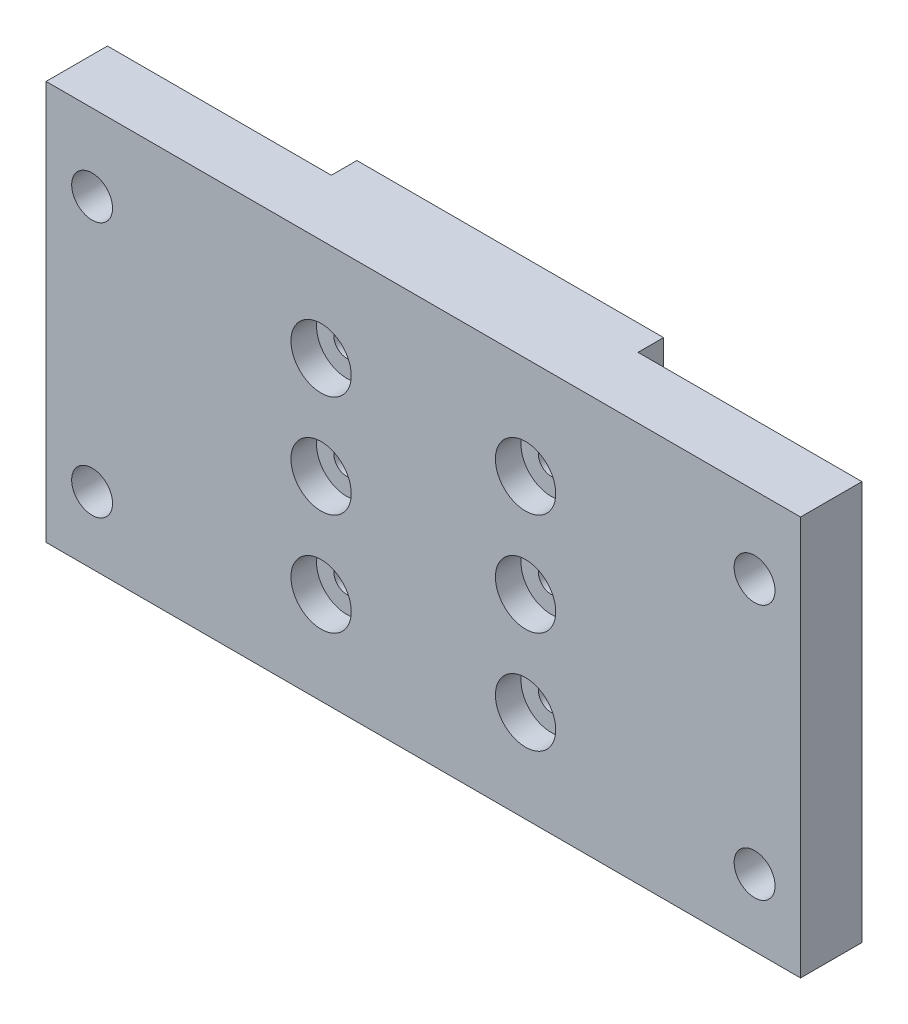
ISO-10303-21;
HEADER;
FILE_DESCRIPTION(('STEP AP214'),'2;1');
FILE_NAME('part.step','',(''),(''),'','','');
FILE_SCHEMA(('AUTOMOTIVE_DESIGN { 1 0 10303 214 1 1 1 1 }'));
ENDSEC;
DATA;
#1=APPLICATION_CONTEXT('core data for automotive mechanical design processes');
#2=APPLICATION_PROTOCOL_DEFINITION('international standard','automotive_design',2000,#1);
#3=PRODUCT_CONTEXT('',#1,'mechanical');
#4=PRODUCT('Part','Part','',(#3));
#5=PRODUCT_RELATED_PRODUCT_CATEGORY('part','',(#4));
#6=PRODUCT_DEFINITION_FORMATION('','',#4);
#7=PRODUCT_DEFINITION_CONTEXT('part definition',#1,'design');
#8=PRODUCT_DEFINITION('design','',#6,#7);
#9=PRODUCT_DEFINITION_SHAPE('','',#8);
#10=(LENGTH_UNIT() NAMED_UNIT(*) SI_UNIT(.MILLI.,.METRE.));
#11=(NAMED_UNIT(*) PLANE_ANGLE_UNIT() SI_UNIT($,.RADIAN.));
#12=(NAMED_UNIT(*) SI_UNIT($,.STERADIAN.) SOLID_ANGLE_UNIT());
#13=UNCERTAINTY_MEASURE_WITH_UNIT(LENGTH_MEASURE(1.E-05),#10,'distance_accuracy_value','');
#14=(GEOMETRIC_REPRESENTATION_CONTEXT(3) GLOBAL_UNCERTAINTY_ASSIGNED_CONTEXT((#13)) GLOBAL_UNIT_ASSIGNED_CONTEXT((#10,
#11,#12)) REPRESENTATION_CONTEXT('',''));
#15=CARTESIAN_POINT('',(0.,0.,0.));
#16=DIRECTION('',(0.,0.,1.));
#17=DIRECTION('',(1.,0.,0.));
#18=AXIS2_PLACEMENT_3D('',#15,#16,#17);
#19=CARTESIAN_POINT('',(20.,19.05,12.));
#20=DIRECTION('',(0.,0.,-1.));
#21=DIRECTION('',(-1.,0.,0.));
#22=AXIS2_PLACEMENT_3D('',#19,#20,#21);
#23=CYLINDRICAL_SURFACE('',#22,2.5);
#24=CARTESIAN_POINT('',(20.,19.05,-5.));
#25=DIRECTION('',(0.,0.,-1.));
#26=DIRECTION('',(-1.,0.,0.));
#27=AXIS2_PLACEMENT_3D('',#24,#25,#26);
#28=CIRCLE('',#27,2.5);
#29=CARTESIAN_POINT('',(17.5,19.05,-5.));
#30=VERTEX_POINT('',#29);
#31=EDGE_CURVE('E185',#30,#30,#28,.T.);
#32=ORIENTED_EDGE('',*,*,#31,.T.);
#33=EDGE_LOOP('',(#32));
#34=FACE_BOUND('',#33,.T.);
#35=CARTESIAN_POINT('',(20.,19.05,7.));
#36=DIRECTION('',(0.,0.,1.));
#37=DIRECTION('',(1.,0.,0.));
#38=AXIS2_PLACEMENT_3D('',#35,#36,#37);
#39=CIRCLE('',#38,2.5);
#40=CARTESIAN_POINT('',(22.5,19.05,7.));
#41=VERTEX_POINT('',#40);
#42=EDGE_CURVE('E41',#41,#41,#39,.F.);
#43=ORIENTED_EDGE('',*,*,#42,.F.);
#44=EDGE_LOOP('',(#43));
#45=FACE_BOUND('',#44,.T.);
#46=ADVANCED_FACE('F37',(#34,#45),#23,.F.);
#47=CARTESIAN_POINT('',(20.,-0.950000000000003,12.));
#48=DIRECTION('',(0.,0.,-1.));
#49=DIRECTION('',(-1.,0.,0.));
#50=AXIS2_PLACEMENT_3D('',#47,#48,#49);
#51=CYLINDRICAL_SURFACE('',#50,2.5);
#52=CARTESIAN_POINT('',(20.,-0.950000000000003,-5.));
#53=DIRECTION('',(0.,0.,-1.));
#54=DIRECTION('',(-1.,0.,0.));
#55=AXIS2_PLACEMENT_3D('',#52,#53,#54);
#56=CIRCLE('',#55,2.5);
#57=CARTESIAN_POINT('',(17.5,-0.950000000000003,-5.));
#58=VERTEX_POINT('',#57);
#59=EDGE_CURVE('E181',#58,#58,#56,.T.);
#60=ORIENTED_EDGE('',*,*,#59,.T.);
#61=EDGE_LOOP('',(#60));
#62=FACE_BOUND('',#61,.T.);
#63=CARTESIAN_POINT('',(20.,-0.950000000000003,7.));
#64=DIRECTION('',(0.,0.,1.));
#65=DIRECTION('',(1.,0.,0.));
#66=AXIS2_PLACEMENT_3D('',#63,#64,#65);
#67=CIRCLE('',#66,2.5);
#68=CARTESIAN_POINT('',(22.5,-0.950000000000003,7.));
#69=VERTEX_POINT('',#68);
#70=EDGE_CURVE('E317',#69,#69,#67,.F.);
#71=ORIENTED_EDGE('',*,*,#70,.F.);
#72=EDGE_LOOP('',(#71));
#73=FACE_BOUND('',#72,.T.);
#74=ADVANCED_FACE('F247',(#62,#73),#51,.F.);
#75=CARTESIAN_POINT('',(20.,-20.95,12.));
#76=DIRECTION('',(0.,0.,-1.));
#77=DIRECTION('',(-1.,0.,0.));
#78=AXIS2_PLACEMENT_3D('',#75,#76,#77);
#79=CYLINDRICAL_SURFACE('',#78,2.5);
#80=CARTESIAN_POINT('',(20.,-20.95,-5.));
#81=DIRECTION('',(0.,0.,-1.));
#82=DIRECTION('',(-1.,0.,0.));
#83=AXIS2_PLACEMENT_3D('',#80,#81,#82);
#84=CIRCLE('',#83,2.5);
#85=CARTESIAN_POINT('',(17.5,-20.95,-5.));
#86=VERTEX_POINT('',#85);
#87=EDGE_CURVE('E186',#86,#86,#84,.T.);
#88=ORIENTED_EDGE('',*,*,#87,.T.);
#89=EDGE_LOOP('',(#88));
#90=FACE_BOUND('',#89,.T.);
#91=CARTESIAN_POINT('',(20.,-20.95,7.));
#92=DIRECTION('',(0.,0.,1.));
#93=DIRECTION('',(1.,0.,0.));
#94=AXIS2_PLACEMENT_3D('',#91,#92,#93);
#95=CIRCLE('',#94,2.5);
#96=CARTESIAN_POINT('',(22.5,-20.95,7.));
#97=VERTEX_POINT('',#96);
#98=EDGE_CURVE('E321',#97,#97,#95,.F.);
#99=ORIENTED_EDGE('',*,*,#98,.F.);
#100=EDGE_LOOP('',(#99));
#101=FACE_BOUND('',#100,.T.);
#102=ADVANCED_FACE('F253',(#90,#101),#79,.F.);
#103=CARTESIAN_POINT('',(-20.,-20.95,12.));
#104=DIRECTION('',(0.,0.,-1.));
#105=DIRECTION('',(-1.,0.,0.));
#106=AXIS2_PLACEMENT_3D('',#103,#104,#105);
#107=CYLINDRICAL_SURFACE('',#106,2.49999999999999);
#108=CARTESIAN_POINT('',(-20.,-20.95,-5.));
#109=DIRECTION('',(0.,0.,-1.));
#110=DIRECTION('',(1.,0.,0.));
#111=AXIS2_PLACEMENT_3D('',#108,#109,#110);
#112=CIRCLE('',#111,2.49999999999999);
#113=CARTESIAN_POINT('',(-17.5,-20.95,-5.));
#114=VERTEX_POINT('',#113);
#115=EDGE_CURVE('E445',#114,#114,#112,.T.);
#116=ORIENTED_EDGE('',*,*,#115,.T.);
#117=EDGE_LOOP('',(#116));
#118=FACE_BOUND('',#117,.T.);
#119=CARTESIAN_POINT('',(-20.,-20.95,7.));
#120=DIRECTION('',(0.,0.,1.));
#121=DIRECTION('',(1.,0.,0.));
#122=AXIS2_PLACEMENT_3D('',#119,#120,#121);
#123=CIRCLE('',#122,2.49999999999999);
#124=CARTESIAN_POINT('',(-17.5,-20.95,7.));
#125=VERTEX_POINT('',#124);
#126=EDGE_CURVE('E325',#125,#125,#123,.F.);
#127=ORIENTED_EDGE('',*,*,#126,.F.);
#128=EDGE_LOOP('',(#127));
#129=FACE_BOUND('',#128,.T.);
#130=ADVANCED_FACE('F430',(#118,#129),#107,.F.);
#131=CARTESIAN_POINT('',(-20.,-0.949999999999998,12.));
#132=DIRECTION('',(0.,0.,-1.));
#133=DIRECTION('',(-1.,0.,0.));
#134=AXIS2_PLACEMENT_3D('',#131,#132,#133);
#135=CYLINDRICAL_SURFACE('',#134,2.49999999999999);
#136=CARTESIAN_POINT('',(-20.,-0.949999999999998,-5.));
#137=DIRECTION('',(0.,0.,-1.));
#138=DIRECTION('',(1.,0.,0.));
#139=AXIS2_PLACEMENT_3D('',#136,#137,#138);
#140=CIRCLE('',#139,2.49999999999999);
#141=CARTESIAN_POINT('',(-17.5,-0.949999999999998,-5.));
#142=VERTEX_POINT('',#141);
#143=EDGE_CURVE('E441',#142,#142,#140,.T.);
#144=ORIENTED_EDGE('',*,*,#143,.T.);
#145=EDGE_LOOP('',(#144));
#146=FACE_BOUND('',#145,.T.);
#147=CARTESIAN_POINT('',(-20.,-0.949999999999998,7.));
#148=DIRECTION('',(0.,0.,1.));
#149=DIRECTION('',(1.,0.,0.));
#150=AXIS2_PLACEMENT_3D('',#147,#148,#149);
#151=CIRCLE('',#150,2.49999999999999);
#152=CARTESIAN_POINT('',(-17.5,-0.949999999999998,7.));
#153=VERTEX_POINT('',#152);
#154=EDGE_CURVE('E330',#153,#153,#151,.F.);
#155=ORIENTED_EDGE('',*,*,#154,.F.);
#156=EDGE_LOOP('',(#155));
#157=FACE_BOUND('',#156,.T.);
#158=ADVANCED_FACE('F237',(#146,#157),#135,.F.);
#159=CARTESIAN_POINT('',(-20.,19.05,12.));
#160=DIRECTION('',(0.,0.,-1.));
#161=DIRECTION('',(-1.,0.,0.));
#162=AXIS2_PLACEMENT_3D('',#159,#160,#161);
#163=CYLINDRICAL_SURFACE('',#162,2.5);
#164=CARTESIAN_POINT('',(-20.,19.05,-5.));
#165=DIRECTION('',(0.,0.,-1.));
#166=DIRECTION('',(1.,0.,0.));
#167=AXIS2_PLACEMENT_3D('',#164,#165,#166);
#168=CIRCLE('',#167,2.5);
#169=CARTESIAN_POINT('',(-17.5,19.05,-5.));
#170=VERTEX_POINT('',#169);
#171=EDGE_CURVE('E180',#170,#170,#168,.T.);
#172=ORIENTED_EDGE('',*,*,#171,.T.);
#173=EDGE_LOOP('',(#172));
#174=FACE_BOUND('',#173,.T.);
#175=CARTESIAN_POINT('',(-20.,19.05,7.));
#176=DIRECTION('',(0.,0.,1.));
#177=DIRECTION('',(1.,0.,0.));
#178=AXIS2_PLACEMENT_3D('',#175,#176,#177);
#179=CIRCLE('',#178,2.5);
#180=CARTESIAN_POINT('',(-17.5,19.05,7.));
#181=VERTEX_POINT('',#180);
#182=EDGE_CURVE('E332',#181,#181,#179,.F.);
#183=ORIENTED_EDGE('',*,*,#182,.F.);
#184=EDGE_LOOP('',(#183));
#185=FACE_BOUND('',#184,.T.);
#186=ADVANCED_FACE('F230',(#174,#185),#163,.F.);
#187=CARTESIAN_POINT('',(0.,0.,0.));
#188=DIRECTION('',(0.,0.,-1.));
#189=DIRECTION('',(-1.,0.,0.));
#190=AXIS2_PLACEMENT_3D('',#187,#188,#189);
#191=PLANE('',#190);
#192=CARTESIAN_POINT('',(64.8,-25.95,0.));
#193=DIRECTION('',(0.,0.,-1.));
#194=DIRECTION('',(-1.,0.,0.));
#195=AXIS2_PLACEMENT_3D('',#192,#193,#194);
#196=CIRCLE('',#195,4.00000000000001);
#197=CARTESIAN_POINT('',(60.8,-25.95,0.));
#198=VERTEX_POINT('',#197);
#199=EDGE_CURVE('E175',#198,#198,#196,.T.);
#200=ORIENTED_EDGE('',*,*,#199,.F.);
#201=EDGE_LOOP('',(#200));
#202=FACE_BOUND('',#201,.T.);
#203=CARTESIAN_POINT('',(64.8,24.05,0.));
#204=DIRECTION('',(0.,0.,-1.));
#205=DIRECTION('',(-1.,0.,0.));
#206=AXIS2_PLACEMENT_3D('',#203,#204,#205);
#207=CIRCLE('',#206,4.00000000000001);
#208=CARTESIAN_POINT('',(60.8,24.05,0.));
#209=VERTEX_POINT('',#208);
#210=EDGE_CURVE('E171',#209,#209,#207,.T.);
#211=ORIENTED_EDGE('',*,*,#210,.F.);
#212=EDGE_LOOP('',(#211));
#213=FACE_BOUND('',#212,.T.);
#214=DIRECTION('',(0.,-1.,0.));
#215=VECTOR('',#214,1.);
#216=CARTESIAN_POINT('',(30.,39.05,0.));
#217=LINE('',#216,#215);
#218=CARTESIAN_POINT('',(30.,39.05,0.));
#219=VERTEX_POINT('',#218);
#220=CARTESIAN_POINT('',(30.,-39.05,0.));
#221=VERTEX_POINT('',#220);
#222=EDGE_CURVE('E54',#219,#221,#217,.T.);
#223=ORIENTED_EDGE('',*,*,#222,.F.);
#224=DIRECTION('',(-1.,0.,0.));
#225=VECTOR('',#224,1.);
#226=CARTESIAN_POINT('',(-73.8,39.05,0.));
#227=LINE('',#226,#225);
#228=CARTESIAN_POINT('',(73.8,39.05,0.));
#229=VERTEX_POINT('',#228);
#230=EDGE_CURVE('E145',#229,#219,#227,.T.);
#231=ORIENTED_EDGE('',*,*,#230,.F.);
#232=DIRECTION('',(0.,1.,0.));
#233=VECTOR('',#232,1.);
#234=CARTESIAN_POINT('',(73.8,-39.05,0.));
#235=LINE('',#234,#233);
#236=CARTESIAN_POINT('',(73.8,-39.05,0.));
#237=VERTEX_POINT('',#236);
#238=EDGE_CURVE('E125',#237,#229,#235,.T.);
#239=ORIENTED_EDGE('',*,*,#238,.F.);
#240=DIRECTION('',(1.,0.,0.));
#241=VECTOR('',#240,1.);
#242=CARTESIAN_POINT('',(-73.8,-39.05,0.));
#243=LINE('',#242,#241);
#244=EDGE_CURVE('E59',#221,#237,#243,.T.);
#245=ORIENTED_EDGE('',*,*,#244,.F.);
#246=EDGE_LOOP('',(#223,#231,#239,#245));
#247=FACE_BOUND('',#246,.T.);
#248=ADVANCED_FACE('F228',(#202,#213,#247),#191,.T.);
#249=CARTESIAN_POINT('',(73.8,-39.05,12.));
#250=DIRECTION('',(-1.,0.,0.));
#251=DIRECTION('',(0.,0.,1.));
#252=AXIS2_PLACEMENT_3D('',#249,#250,#251);
#253=PLANE('',#252);
#254=ORIENTED_EDGE('',*,*,#238,.T.);
#255=DIRECTION('',(0.,0.,-1.));
#256=VECTOR('',#255,1.);
#257=CARTESIAN_POINT('',(73.8,39.05,12.));
#258=LINE('',#257,#256);
#259=CARTESIAN_POINT('',(73.8,39.05,12.));
#260=VERTEX_POINT('',#259);
#261=EDGE_CURVE('E12',#260,#229,#258,.T.);
#262=ORIENTED_EDGE('',*,*,#261,.F.);
#263=DIRECTION('',(0.,1.,0.));
#264=VECTOR('',#263,1.);
#265=CARTESIAN_POINT('',(73.8,-39.05,12.));
#266=LINE('',#265,#264);
#267=CARTESIAN_POINT('',(73.8,-39.05,12.));
#268=VERTEX_POINT('',#267);
#269=EDGE_CURVE('E134',#268,#260,#266,.T.);
#270=ORIENTED_EDGE('',*,*,#269,.F.);
#271=DIRECTION('',(0.,0.,-1.));
#272=VECTOR('',#271,1.);
#273=CARTESIAN_POINT('',(73.8,-39.05,12.));
#274=LINE('',#273,#272);
#275=EDGE_CURVE('E143',#268,#237,#274,.T.);
#276=ORIENTED_EDGE('',*,*,#275,.T.);
#277=EDGE_LOOP('',(#254,#262,#270,#276));
#278=FACE_BOUND('',#277,.T.);
#279=ADVANCED_FACE('F39',(#278),#253,.F.);
#280=CARTESIAN_POINT('',(-73.8,39.05,12.));
#281=DIRECTION('',(0.,-1.,0.));
#282=DIRECTION('',(0.,0.,-1.));
#283=AXIS2_PLACEMENT_3D('',#280,#281,#282);
#284=PLANE('',#283);
#285=ORIENTED_EDGE('',*,*,#230,.T.);
#286=DIRECTION('',(0.,0.,1.));
#287=VECTOR('',#286,1.);
#288=CARTESIAN_POINT('',(30.,39.05,-5.));
#289=LINE('',#288,#287);
#290=CARTESIAN_POINT('',(30.,39.05,-5.));
#291=VERTEX_POINT('',#290);
#292=EDGE_CURVE('E202',#291,#219,#289,.T.);
#293=ORIENTED_EDGE('',*,*,#292,.F.);
#294=DIRECTION('',(1.,0.,0.));
#295=VECTOR('',#294,1.);
#296=CARTESIAN_POINT('',(30.,39.05,-5.));
#297=LINE('',#296,#295);
#298=CARTESIAN_POINT('',(-30.,39.05,-5.));
#299=VERTEX_POINT('',#298);
#300=EDGE_CURVE('E118',#299,#291,#297,.T.);
#301=ORIENTED_EDGE('',*,*,#300,.F.);
#302=DIRECTION('',(0.,0.,1.));
#303=VECTOR('',#302,1.);
#304=CARTESIAN_POINT('',(-30.,39.05,-5.));
#305=LINE('',#304,#303);
#306=CARTESIAN_POINT('',(-30.,39.05,0.));
#307=VERTEX_POINT('',#306);
#308=EDGE_CURVE('E130',#299,#307,#305,.T.);
#309=ORIENTED_EDGE('',*,*,#308,.T.);
#310=CARTESIAN_POINT('',(-73.8,39.05,0.));
#311=VERTEX_POINT('',#310);
#312=EDGE_CURVE('E128',#307,#311,#227,.T.);
#313=ORIENTED_EDGE('',*,*,#312,.T.);
#314=DIRECTION('',(0.,0.,-1.));
#315=VECTOR('',#314,1.);
#316=CARTESIAN_POINT('',(-73.8,39.05,12.));
#317=LINE('',#316,#315);
#318=CARTESIAN_POINT('',(-73.8,39.05,12.));
#319=VERTEX_POINT('',#318);
#320=EDGE_CURVE('E46',#319,#311,#317,.T.);
#321=ORIENTED_EDGE('',*,*,#320,.F.);
#322=DIRECTION('',(-1.,0.,0.));
#323=VECTOR('',#322,1.);
#324=CARTESIAN_POINT('',(-73.8,39.05,12.));
#325=LINE('',#324,#323);
#326=EDGE_CURVE('E137',#260,#319,#325,.T.);
#327=ORIENTED_EDGE('',*,*,#326,.F.);
#328=ORIENTED_EDGE('',*,*,#261,.T.);
#329=EDGE_LOOP('',(#285,#293,#301,#309,#313,#321,#327,#328));
#330=FACE_BOUND('',#329,.T.);
#331=ADVANCED_FACE('F209',(#330),#284,.F.);
#332=CARTESIAN_POINT('',(-73.8,-39.05,12.));
#333=DIRECTION('',(1.,0.,0.));
#334=DIRECTION('',(0.,0.,-1.));
#335=AXIS2_PLACEMENT_3D('',#332,#333,#334);
#336=PLANE('',#335);
#337=DIRECTION('',(0.,-1.,0.));
#338=VECTOR('',#337,1.);
#339=CARTESIAN_POINT('',(-73.8,-39.05,0.));
#340=LINE('',#339,#338);
#341=CARTESIAN_POINT('',(-73.8,-39.05,0.));
#342=VERTEX_POINT('',#341);
#343=EDGE_CURVE('E147',#311,#342,#340,.T.);
#344=ORIENTED_EDGE('',*,*,#343,.T.);
#345=DIRECTION('',(0.,0.,-1.));
#346=VECTOR('',#345,1.);
#347=CARTESIAN_POINT('',(-73.8,-39.05,12.));
#348=LINE('',#347,#346);
#349=CARTESIAN_POINT('',(-73.8,-39.05,12.));
#350=VERTEX_POINT('',#349);
#351=EDGE_CURVE('E152',#350,#342,#348,.T.);
#352=ORIENTED_EDGE('',*,*,#351,.F.);
#353=DIRECTION('',(0.,-1.,0.));
#354=VECTOR('',#353,1.);
#355=CARTESIAN_POINT('',(-73.8,-39.05,12.));
#356=LINE('',#355,#354);
#357=EDGE_CURVE('E140',#319,#350,#356,.T.);
#358=ORIENTED_EDGE('',*,*,#357,.F.);
#359=ORIENTED_EDGE('',*,*,#320,.T.);
#360=EDGE_LOOP('',(#344,#352,#358,#359));
#361=FACE_BOUND('',#360,.T.);
#362=ADVANCED_FACE('F222',(#361),#336,.F.);
#363=CARTESIAN_POINT('',(-73.8,-39.05,12.));
#364=DIRECTION('',(0.,1.,0.));
#365=DIRECTION('',(0.,0.,1.));
#366=AXIS2_PLACEMENT_3D('',#363,#364,#365);
#367=PLANE('',#366);
#368=CARTESIAN_POINT('',(-30.,-39.05,0.));
#369=VERTEX_POINT('',#368);
#370=EDGE_CURVE('E138',#342,#369,#243,.T.);
#371=ORIENTED_EDGE('',*,*,#370,.T.);
#372=DIRECTION('',(0.,0.,1.));
#373=VECTOR('',#372,1.);
#374=CARTESIAN_POINT('',(-30.,-39.05,-5.));
#375=LINE('',#374,#373);
#376=CARTESIAN_POINT('',(-30.,-39.05,-5.));
#377=VERTEX_POINT('',#376);
#378=EDGE_CURVE('E109',#377,#369,#375,.T.);
#379=ORIENTED_EDGE('',*,*,#378,.F.);
#380=DIRECTION('',(-1.,0.,0.));
#381=VECTOR('',#380,1.);
#382=CARTESIAN_POINT('',(30.,-39.05,-5.));
#383=LINE('',#382,#381);
#384=CARTESIAN_POINT('',(30.,-39.05,-5.));
#385=VERTEX_POINT('',#384);
#386=EDGE_CURVE('E102',#385,#377,#383,.T.);
#387=ORIENTED_EDGE('',*,*,#386,.F.);
#388=DIRECTION('',(0.,0.,1.));
#389=VECTOR('',#388,1.);
#390=CARTESIAN_POINT('',(30.,-39.05,-5.));
#391=LINE('',#390,#389);
#392=EDGE_CURVE('E107',#385,#221,#391,.T.);
#393=ORIENTED_EDGE('',*,*,#392,.T.);
#394=ORIENTED_EDGE('',*,*,#244,.T.);
#395=ORIENTED_EDGE('',*,*,#275,.F.);
#396=DIRECTION('',(1.,0.,0.));
#397=VECTOR('',#396,1.);
#398=CARTESIAN_POINT('',(-73.8,-39.05,12.));
#399=LINE('',#398,#397);
#400=EDGE_CURVE('E142',#350,#268,#399,.T.);
#401=ORIENTED_EDGE('',*,*,#400,.F.);
#402=ORIENTED_EDGE('',*,*,#351,.T.);
#403=EDGE_LOOP('',(#371,#379,#387,#393,#394,#395,#401,#402));
#404=FACE_BOUND('',#403,.T.);
#405=ADVANCED_FACE('F105',(#404),#367,.F.);
#406=CARTESIAN_POINT('',(0.,0.,12.));
#407=DIRECTION('',(0.,0.,-1.));
#408=DIRECTION('',(-1.,0.,0.));
#409=AXIS2_PLACEMENT_3D('',#406,#407,#408);
#410=PLANE('',#409);
#411=CARTESIAN_POINT('',(-20.,-20.95,12.));
#412=DIRECTION('',(0.,0.,1.));
#413=DIRECTION('',(1.,0.,0.));
#414=AXIS2_PLACEMENT_3D('',#411,#412,#413);
#415=CIRCLE('',#414,5.9);
#416=CARTESIAN_POINT('',(-14.1,-20.95,12.));
#417=VERTEX_POINT('',#416);
#418=EDGE_CURVE('E274',#417,#417,#415,.T.);
#419=ORIENTED_EDGE('',*,*,#418,.F.);
#420=EDGE_LOOP('',(#419));
#421=FACE_BOUND('',#420,.T.);
#422=CARTESIAN_POINT('',(20.,-0.950000000000003,12.));
#423=DIRECTION('',(0.,0.,1.));
#424=DIRECTION('',(1.,0.,0.));
#425=AXIS2_PLACEMENT_3D('',#422,#423,#424);
#426=CIRCLE('',#425,5.9);
#427=CARTESIAN_POINT('',(25.9,-0.950000000000003,12.));
#428=VERTEX_POINT('',#427);
#429=EDGE_CURVE('E278',#428,#428,#426,.T.);
#430=ORIENTED_EDGE('',*,*,#429,.F.);
#431=EDGE_LOOP('',(#430));
#432=FACE_BOUND('',#431,.T.);
#433=CARTESIAN_POINT('',(-20.,-0.949999999999998,12.));
#434=DIRECTION('',(0.,0.,1.));
#435=DIRECTION('',(1.,0.,0.));
#436=AXIS2_PLACEMENT_3D('',#433,#434,#435);
#437=CIRCLE('',#436,5.9);
#438=CARTESIAN_POINT('',(-14.1,-0.949999999999998,12.));
#439=VERTEX_POINT('',#438);
#440=EDGE_CURVE('E282',#439,#439,#437,.T.);
#441=ORIENTED_EDGE('',*,*,#440,.F.);
#442=EDGE_LOOP('',(#441));
#443=FACE_BOUND('',#442,.T.);
#444=CARTESIAN_POINT('',(20.,19.05,12.));
#445=DIRECTION('',(0.,0.,1.));
#446=DIRECTION('',(1.,0.,0.));
#447=AXIS2_PLACEMENT_3D('',#444,#445,#446);
#448=CIRCLE('',#447,5.9);
#449=CARTESIAN_POINT('',(25.9,19.05,12.));
#450=VERTEX_POINT('',#449);
#451=EDGE_CURVE('E286',#450,#450,#448,.T.);
#452=ORIENTED_EDGE('',*,*,#451,.F.);
#453=EDGE_LOOP('',(#452));
#454=FACE_BOUND('',#453,.T.);
#455=CARTESIAN_POINT('',(20.,-20.95,12.));
#456=DIRECTION('',(0.,0.,1.));
#457=DIRECTION('',(1.,0.,0.));
#458=AXIS2_PLACEMENT_3D('',#455,#456,#457);
#459=CIRCLE('',#458,5.9);
#460=CARTESIAN_POINT('',(25.9,-20.95,12.));
#461=VERTEX_POINT('',#460);
#462=EDGE_CURVE('E290',#461,#461,#459,.T.);
#463=ORIENTED_EDGE('',*,*,#462,.F.);
#464=EDGE_LOOP('',(#463));
#465=FACE_BOUND('',#464,.T.);
#466=CARTESIAN_POINT('',(-20.,19.05,12.));
#467=DIRECTION('',(0.,0.,1.));
#468=DIRECTION('',(1.,0.,0.));
#469=AXIS2_PLACEMENT_3D('',#466,#467,#468);
#470=CIRCLE('',#469,5.9);
#471=CARTESIAN_POINT('',(-14.1,19.05,12.));
#472=VERTEX_POINT('',#471);
#473=EDGE_CURVE('E294',#472,#472,#470,.T.);
#474=ORIENTED_EDGE('',*,*,#473,.F.);
#475=EDGE_LOOP('',(#474));
#476=FACE_BOUND('',#475,.T.);
#477=CARTESIAN_POINT('',(-64.8,24.05,12.));
#478=DIRECTION('',(0.,0.,1.));
#479=DIRECTION('',(-1.,0.,0.));
#480=AXIS2_PLACEMENT_3D('',#477,#478,#479);
#481=CIRCLE('',#480,4.00000000000001);
#482=CARTESIAN_POINT('',(-68.8,24.05,12.));
#483=VERTEX_POINT('',#482);
#484=EDGE_CURVE('E298',#483,#483,#481,.T.);
#485=ORIENTED_EDGE('',*,*,#484,.F.);
#486=EDGE_LOOP('',(#485));
#487=FACE_BOUND('',#486,.T.);
#488=CARTESIAN_POINT('',(-64.8,-25.95,12.));
#489=DIRECTION('',(0.,0.,1.));
#490=DIRECTION('',(-1.,0.,0.));
#491=AXIS2_PLACEMENT_3D('',#488,#489,#490);
#492=CIRCLE('',#491,4.00000000000001);
#493=CARTESIAN_POINT('',(-68.8,-25.95,12.));
#494=VERTEX_POINT('',#493);
#495=EDGE_CURVE('E302',#494,#494,#492,.T.);
#496=ORIENTED_EDGE('',*,*,#495,.F.);
#497=EDGE_LOOP('',(#496));
#498=FACE_BOUND('',#497,.T.);
#499=CARTESIAN_POINT('',(64.8,-25.95,12.));
#500=DIRECTION('',(0.,0.,1.));
#501=DIRECTION('',(1.,0.,0.));
#502=AXIS2_PLACEMENT_3D('',#499,#500,#501);
#503=CIRCLE('',#502,4.00000000000001);
#504=CARTESIAN_POINT('',(68.8,-25.95,12.));
#505=VERTEX_POINT('',#504);
#506=EDGE_CURVE('E306',#505,#505,#503,.T.);
#507=ORIENTED_EDGE('',*,*,#506,.F.);
#508=EDGE_LOOP('',(#507));
#509=FACE_BOUND('',#508,.T.);
#510=CARTESIAN_POINT('',(64.8,24.05,12.));
#511=DIRECTION('',(0.,0.,1.));
#512=DIRECTION('',(1.,0.,0.));
#513=AXIS2_PLACEMENT_3D('',#510,#511,#512);
#514=CIRCLE('',#513,4.00000000000001);
#515=CARTESIAN_POINT('',(68.8,24.05,12.));
#516=VERTEX_POINT('',#515);
#517=EDGE_CURVE('E162',#516,#516,#514,.T.);
#518=ORIENTED_EDGE('',*,*,#517,.F.);
#519=EDGE_LOOP('',(#518));
#520=FACE_BOUND('',#519,.T.);
#521=ORIENTED_EDGE('',*,*,#269,.T.);
#522=ORIENTED_EDGE('',*,*,#326,.T.);
#523=ORIENTED_EDGE('',*,*,#357,.T.);
#524=ORIENTED_EDGE('',*,*,#400,.T.);
#525=EDGE_LOOP('',(#521,#522,#523,#524));
#526=FACE_BOUND('',#525,.T.);
#527=ADVANCED_FACE('F226',(#421,#432,#443,#454,#465,#476,#487,#498,#509,#520,#526),#410,.F.);
#528=CARTESIAN_POINT('',(-64.8,24.05,0.));
#529=DIRECTION('',(0.,0.,-1.));
#530=DIRECTION('',(-1.,0.,0.));
#531=AXIS2_PLACEMENT_3D('',#528,#529,#530);
#532=CIRCLE('',#531,4.00000000000001);
#533=CARTESIAN_POINT('',(-68.8,24.05,0.));
#534=VERTEX_POINT('',#533);
#535=EDGE_CURVE('E161',#534,#534,#532,.T.);
#536=ORIENTED_EDGE('',*,*,#535,.F.);
#537=EDGE_LOOP('',(#536));
#538=FACE_BOUND('',#537,.T.);
#539=CARTESIAN_POINT('',(-64.8,-25.95,0.));
#540=DIRECTION('',(0.,0.,-1.));
#541=DIRECTION('',(-1.,0.,0.));
#542=AXIS2_PLACEMENT_3D('',#539,#540,#541);
#543=CIRCLE('',#542,4.00000000000001);
#544=CARTESIAN_POINT('',(-68.8,-25.95,0.));
#545=VERTEX_POINT('',#544);
#546=EDGE_CURVE('E157',#545,#545,#543,.T.);
#547=ORIENTED_EDGE('',*,*,#546,.F.);
#548=EDGE_LOOP('',(#547));
#549=FACE_BOUND('',#548,.T.);
#550=DIRECTION('',(0.,1.,0.));
#551=VECTOR('',#550,1.);
#552=CARTESIAN_POINT('',(-30.,39.05,0.));
#553=LINE('',#552,#551);
#554=EDGE_CURVE('E122',#369,#307,#553,.T.);
#555=ORIENTED_EDGE('',*,*,#554,.F.);
#556=ORIENTED_EDGE('',*,*,#370,.F.);
#557=ORIENTED_EDGE('',*,*,#343,.F.);
#558=ORIENTED_EDGE('',*,*,#312,.F.);
#559=EDGE_LOOP('',(#555,#556,#557,#558));
#560=FACE_BOUND('',#559,.T.);
#561=ADVANCED_FACE('F215',(#538,#549,#560),#191,.T.);
#562=CARTESIAN_POINT('',(30.,39.05,-5.));
#563=DIRECTION('',(-1.,0.,0.));
#564=DIRECTION('',(0.,-1.,0.));
#565=AXIS2_PLACEMENT_3D('',#562,#563,#564);
#566=PLANE('',#565);
#567=ORIENTED_EDGE('',*,*,#222,.T.);
#568=ORIENTED_EDGE('',*,*,#392,.F.);
#569=DIRECTION('',(0.,-1.,0.));
#570=VECTOR('',#569,1.);
#571=CARTESIAN_POINT('',(30.,39.05,-5.));
#572=LINE('',#571,#570);
#573=EDGE_CURVE('E113',#291,#385,#572,.T.);
#574=ORIENTED_EDGE('',*,*,#573,.F.);
#575=ORIENTED_EDGE('',*,*,#292,.T.);
#576=EDGE_LOOP('',(#567,#568,#574,#575));
#577=FACE_BOUND('',#576,.T.);
#578=ADVANCED_FACE('F124',(#577),#566,.F.);
#579=CARTESIAN_POINT('',(-30.,39.05,-5.));
#580=DIRECTION('',(1.,0.,0.));
#581=DIRECTION('',(0.,1.,0.));
#582=AXIS2_PLACEMENT_3D('',#579,#580,#581);
#583=PLANE('',#582);
#584=ORIENTED_EDGE('',*,*,#554,.T.);
#585=ORIENTED_EDGE('',*,*,#308,.F.);
#586=DIRECTION('',(0.,1.,0.));
#587=VECTOR('',#586,1.);
#588=CARTESIAN_POINT('',(-30.,39.05,-5.));
#589=LINE('',#588,#587);
#590=EDGE_CURVE('E112',#377,#299,#589,.T.);
#591=ORIENTED_EDGE('',*,*,#590,.F.);
#592=ORIENTED_EDGE('',*,*,#378,.T.);
#593=EDGE_LOOP('',(#584,#585,#591,#592));
#594=FACE_BOUND('',#593,.T.);
#595=ADVANCED_FACE('F212',(#594),#583,.F.);
#596=CARTESIAN_POINT('',(0.,0.,-5.));
#597=DIRECTION('',(0.,0.,-1.));
#598=DIRECTION('',(-1.,0.,0.));
#599=AXIS2_PLACEMENT_3D('',#596,#597,#598);
#600=PLANE('',#599);
#601=ORIENTED_EDGE('',*,*,#171,.F.);
#602=EDGE_LOOP('',(#601));
#603=FACE_BOUND('',#602,.T.);
#604=ORIENTED_EDGE('',*,*,#143,.F.);
#605=EDGE_LOOP('',(#604));
#606=FACE_BOUND('',#605,.T.);
#607=ORIENTED_EDGE('',*,*,#115,.F.);
#608=EDGE_LOOP('',(#607));
#609=FACE_BOUND('',#608,.T.);
#610=ORIENTED_EDGE('',*,*,#87,.F.);
#611=EDGE_LOOP('',(#610));
#612=FACE_BOUND('',#611,.T.);
#613=ORIENTED_EDGE('',*,*,#59,.F.);
#614=EDGE_LOOP('',(#613));
#615=FACE_BOUND('',#614,.T.);
#616=ORIENTED_EDGE('',*,*,#31,.F.);
#617=EDGE_LOOP('',(#616));
#618=FACE_BOUND('',#617,.T.);
#619=ORIENTED_EDGE('',*,*,#573,.T.);
#620=ORIENTED_EDGE('',*,*,#386,.T.);
#621=ORIENTED_EDGE('',*,*,#590,.T.);
#622=ORIENTED_EDGE('',*,*,#300,.T.);
#623=EDGE_LOOP('',(#619,#620,#621,#622));
#624=FACE_BOUND('',#623,.T.);
#625=ADVANCED_FACE('F116',(#603,#606,#609,#612,#615,#618,#624),#600,.T.);
#626=CARTESIAN_POINT('',(-64.8,-25.95,-5.));
#627=DIRECTION('',(0.,0.,1.));
#628=DIRECTION('',(1.,0.,0.));
#629=AXIS2_PLACEMENT_3D('',#626,#627,#628);
#630=CYLINDRICAL_SURFACE('',#629,4.00000000000001);
#631=ORIENTED_EDGE('',*,*,#546,.T.);
#632=EDGE_LOOP('',(#631));
#633=FACE_BOUND('',#632,.T.);
#634=ORIENTED_EDGE('',*,*,#495,.T.);
#635=EDGE_LOOP('',(#634));
#636=FACE_BOUND('',#635,.T.);
#637=ADVANCED_FACE('F261',(#633,#636),#630,.F.);
#638=CARTESIAN_POINT('',(-64.8,24.05,-5.));
#639=DIRECTION('',(0.,0.,1.));
#640=DIRECTION('',(1.,0.,0.));
#641=AXIS2_PLACEMENT_3D('',#638,#639,#640);
#642=CYLINDRICAL_SURFACE('',#641,4.00000000000001);
#643=ORIENTED_EDGE('',*,*,#535,.T.);
#644=EDGE_LOOP('',(#643));
#645=FACE_BOUND('',#644,.T.);
#646=ORIENTED_EDGE('',*,*,#484,.T.);
#647=EDGE_LOOP('',(#646));
#648=FACE_BOUND('',#647,.T.);
#649=ADVANCED_FACE('F420',(#645,#648),#642,.F.);
#650=CARTESIAN_POINT('',(64.8,24.05,-5.));
#651=DIRECTION('',(0.,0.,1.));
#652=DIRECTION('',(1.,0.,0.));
#653=AXIS2_PLACEMENT_3D('',#650,#651,#652);
#654=CYLINDRICAL_SURFACE('',#653,4.00000000000001);
#655=ORIENTED_EDGE('',*,*,#210,.T.);
#656=EDGE_LOOP('',(#655));
#657=FACE_BOUND('',#656,.T.);
#658=ORIENTED_EDGE('',*,*,#517,.T.);
#659=EDGE_LOOP('',(#658));
#660=FACE_BOUND('',#659,.T.);
#661=ADVANCED_FACE('F416',(#657,#660),#654,.F.);
#662=CARTESIAN_POINT('',(64.8,-25.95,-5.));
#663=DIRECTION('',(0.,0.,1.));
#664=DIRECTION('',(1.,0.,0.));
#665=AXIS2_PLACEMENT_3D('',#662,#663,#664);
#666=CYLINDRICAL_SURFACE('',#665,4.00000000000001);
#667=ORIENTED_EDGE('',*,*,#199,.T.);
#668=EDGE_LOOP('',(#667));
#669=FACE_BOUND('',#668,.T.);
#670=ORIENTED_EDGE('',*,*,#506,.T.);
#671=EDGE_LOOP('',(#670));
#672=FACE_BOUND('',#671,.T.);
#673=ADVANCED_FACE('F410',(#669,#672),#666,.F.);
#674=CARTESIAN_POINT('',(-20.,19.05,7.));
#675=DIRECTION('',(0.,0.,1.));
#676=DIRECTION('',(1.,0.,0.));
#677=AXIS2_PLACEMENT_3D('',#674,#675,#676);
#678=PLANE('',#677);
#679=CARTESIAN_POINT('',(-20.,19.05,7.));
#680=DIRECTION('',(0.,0.,1.));
#681=DIRECTION('',(1.,0.,0.));
#682=AXIS2_PLACEMENT_3D('',#679,#680,#681);
#683=CIRCLE('',#682,5.9);
#684=CARTESIAN_POINT('',(-14.1,19.05,7.));
#685=VERTEX_POINT('',#684);
#686=EDGE_CURVE('E334',#685,#685,#683,.T.);
#687=ORIENTED_EDGE('',*,*,#686,.T.);
#688=EDGE_LOOP('',(#687));
#689=FACE_BOUND('',#688,.T.);
#690=ORIENTED_EDGE('',*,*,#182,.T.);
#691=EDGE_LOOP('',(#690));
#692=FACE_BOUND('',#691,.T.);
#693=ADVANCED_FACE('F407',(#689,#692),#678,.T.);
#694=CARTESIAN_POINT('',(-20.,19.05,7.));
#695=DIRECTION('',(0.,0.,1.));
#696=DIRECTION('',(1.,0.,0.));
#697=AXIS2_PLACEMENT_3D('',#694,#695,#696);
#698=CYLINDRICAL_SURFACE('',#697,5.9);
#699=ORIENTED_EDGE('',*,*,#686,.F.);
#700=EDGE_LOOP('',(#699));
#701=FACE_BOUND('',#700,.T.);
#702=ORIENTED_EDGE('',*,*,#473,.T.);
#703=EDGE_LOOP('',(#702));
#704=FACE_BOUND('',#703,.T.);
#705=ADVANCED_FACE('F402',(#701,#704),#698,.F.);
#706=CARTESIAN_POINT('',(-20.,-0.949999999999998,7.));
#707=DIRECTION('',(0.,0.,1.));
#708=DIRECTION('',(1.,0.,0.));
#709=AXIS2_PLACEMENT_3D('',#706,#707,#708);
#710=PLANE('',#709);
#711=CARTESIAN_POINT('',(-20.,-0.949999999999998,7.));
#712=DIRECTION('',(0.,0.,1.));
#713=DIRECTION('',(1.,0.,0.));
#714=AXIS2_PLACEMENT_3D('',#711,#712,#713);
#715=CIRCLE('',#714,5.9);
#716=CARTESIAN_POINT('',(-14.1,-0.949999999999998,7.));
#717=VERTEX_POINT('',#716);
#718=EDGE_CURVE('E343',#717,#717,#715,.T.);
#719=ORIENTED_EDGE('',*,*,#718,.T.);
#720=EDGE_LOOP('',(#719));
#721=FACE_BOUND('',#720,.T.);
#722=ORIENTED_EDGE('',*,*,#154,.T.);
#723=EDGE_LOOP('',(#722));
#724=FACE_BOUND('',#723,.T.);
#725=ADVANCED_FACE('F399',(#721,#724),#710,.T.);
#726=CARTESIAN_POINT('',(-20.,-0.949999999999998,7.));
#727=DIRECTION('',(0.,0.,1.));
#728=DIRECTION('',(1.,0.,0.));
#729=AXIS2_PLACEMENT_3D('',#726,#727,#728);
#730=CYLINDRICAL_SURFACE('',#729,5.9);
#731=ORIENTED_EDGE('',*,*,#718,.F.);
#732=EDGE_LOOP('',(#731));
#733=FACE_BOUND('',#732,.T.);
#734=ORIENTED_EDGE('',*,*,#440,.T.);
#735=EDGE_LOOP('',(#734));
#736=FACE_BOUND('',#735,.T.);
#737=ADVANCED_FACE('F387',(#733,#736),#730,.F.);
#738=CARTESIAN_POINT('',(-20.,-20.95,7.));
#739=DIRECTION('',(0.,0.,1.));
#740=DIRECTION('',(1.,0.,0.));
#741=AXIS2_PLACEMENT_3D('',#738,#739,#740);
#742=PLANE('',#741);
#743=CARTESIAN_POINT('',(-20.,-20.95,7.));
#744=DIRECTION('',(0.,0.,1.));
#745=DIRECTION('',(1.,0.,0.));
#746=AXIS2_PLACEMENT_3D('',#743,#744,#745);
#747=CIRCLE('',#746,5.9);
#748=CARTESIAN_POINT('',(-14.1,-20.95,7.));
#749=VERTEX_POINT('',#748);
#750=EDGE_CURVE('E351',#749,#749,#747,.T.);
#751=ORIENTED_EDGE('',*,*,#750,.T.);
#752=EDGE_LOOP('',(#751));
#753=FACE_BOUND('',#752,.T.);
#754=ORIENTED_EDGE('',*,*,#126,.T.);
#755=EDGE_LOOP('',(#754));
#756=FACE_BOUND('',#755,.T.);
#757=ADVANCED_FACE('F384',(#753,#756),#742,.T.);
#758=CARTESIAN_POINT('',(-20.,-20.95,7.));
#759=DIRECTION('',(0.,0.,1.));
#760=DIRECTION('',(1.,0.,0.));
#761=AXIS2_PLACEMENT_3D('',#758,#759,#760);
#762=CYLINDRICAL_SURFACE('',#761,5.9);
#763=ORIENTED_EDGE('',*,*,#750,.F.);
#764=EDGE_LOOP('',(#763));
#765=FACE_BOUND('',#764,.T.);
#766=ORIENTED_EDGE('',*,*,#418,.T.);
#767=EDGE_LOOP('',(#766));
#768=FACE_BOUND('',#767,.T.);
#769=ADVANCED_FACE('F377',(#765,#768),#762,.F.);
#770=CARTESIAN_POINT('',(20.,-20.95,7.));
#771=DIRECTION('',(0.,0.,1.));
#772=DIRECTION('',(1.,0.,0.));
#773=AXIS2_PLACEMENT_3D('',#770,#771,#772);
#774=PLANE('',#773);
#775=CARTESIAN_POINT('',(20.,-20.95,7.));
#776=DIRECTION('',(0.,0.,1.));
#777=DIRECTION('',(1.,0.,0.));
#778=AXIS2_PLACEMENT_3D('',#775,#776,#777);
#779=CIRCLE('',#778,5.9);
#780=CARTESIAN_POINT('',(25.9,-20.95,7.));
#781=VERTEX_POINT('',#780);
#782=EDGE_CURVE('E352',#781,#781,#779,.T.);
#783=ORIENTED_EDGE('',*,*,#782,.T.);
#784=EDGE_LOOP('',(#783));
#785=FACE_BOUND('',#784,.T.);
#786=ORIENTED_EDGE('',*,*,#98,.T.);
#787=EDGE_LOOP('',(#786));
#788=FACE_BOUND('',#787,.T.);
#789=ADVANCED_FACE('F362',(#785,#788),#774,.T.);
#790=CARTESIAN_POINT('',(20.,-20.95,7.));
#791=DIRECTION('',(0.,0.,1.));
#792=DIRECTION('',(1.,0.,0.));
#793=AXIS2_PLACEMENT_3D('',#790,#791,#792);
#794=CYLINDRICAL_SURFACE('',#793,5.9);
#795=ORIENTED_EDGE('',*,*,#782,.F.);
#796=EDGE_LOOP('',(#795));
#797=FACE_BOUND('',#796,.T.);
#798=ORIENTED_EDGE('',*,*,#462,.T.);
#799=EDGE_LOOP('',(#798));
#800=FACE_BOUND('',#799,.T.);
#801=ADVANCED_FACE('F365',(#797,#800),#794,.F.);
#802=CARTESIAN_POINT('',(20.,-0.950000000000003,7.));
#803=DIRECTION('',(0.,0.,1.));
#804=DIRECTION('',(1.,0.,0.));
#805=AXIS2_PLACEMENT_3D('',#802,#803,#804);
#806=PLANE('',#805);
#807=CARTESIAN_POINT('',(20.,-0.950000000000003,7.));
#808=DIRECTION('',(0.,0.,1.));
#809=DIRECTION('',(1.,0.,0.));
#810=AXIS2_PLACEMENT_3D('',#807,#808,#809);
#811=CIRCLE('',#810,5.9);
#812=CARTESIAN_POINT('',(25.9,-0.950000000000003,7.));
#813=VERTEX_POINT('',#812);
#814=EDGE_CURVE('E344',#813,#813,#811,.T.);
#815=ORIENTED_EDGE('',*,*,#814,.T.);
#816=EDGE_LOOP('',(#815));
#817=FACE_BOUND('',#816,.T.);
#818=ORIENTED_EDGE('',*,*,#70,.T.);
#819=EDGE_LOOP('',(#818));
#820=FACE_BOUND('',#819,.T.);
#821=ADVANCED_FACE('F368',(#817,#820),#806,.T.);
#822=CARTESIAN_POINT('',(20.,-0.950000000000003,7.));
#823=DIRECTION('',(0.,0.,1.));
#824=DIRECTION('',(1.,0.,0.));
#825=AXIS2_PLACEMENT_3D('',#822,#823,#824);
#826=CYLINDRICAL_SURFACE('',#825,5.9);
#827=ORIENTED_EDGE('',*,*,#814,.F.);
#828=EDGE_LOOP('',(#827));
#829=FACE_BOUND('',#828,.T.);
#830=ORIENTED_EDGE('',*,*,#429,.T.);
#831=EDGE_LOOP('',(#830));
#832=FACE_BOUND('',#831,.T.);
#833=ADVANCED_FACE('F374',(#829,#832),#826,.F.);
#834=CARTESIAN_POINT('',(20.,19.05,7.));
#835=DIRECTION('',(0.,0.,1.));
#836=DIRECTION('',(1.,0.,0.));
#837=AXIS2_PLACEMENT_3D('',#834,#835,#836);
#838=PLANE('',#837);
#839=CARTESIAN_POINT('',(20.,19.05,7.));
#840=DIRECTION('',(0.,0.,1.));
#841=DIRECTION('',(1.,0.,0.));
#842=AXIS2_PLACEMENT_3D('',#839,#840,#841);
#843=CIRCLE('',#842,5.9);
#844=CARTESIAN_POINT('',(25.9,19.05,7.));
#845=VERTEX_POINT('',#844);
#846=EDGE_CURVE('E340',#845,#845,#843,.T.);
#847=ORIENTED_EDGE('',*,*,#846,.T.);
#848=EDGE_LOOP('',(#847));
#849=FACE_BOUND('',#848,.T.);
#850=ORIENTED_EDGE('',*,*,#42,.T.);
#851=EDGE_LOOP('',(#850));
#852=FACE_BOUND('',#851,.T.);
#853=ADVANCED_FACE('F382',(#849,#852),#838,.T.);
#854=CARTESIAN_POINT('',(20.,19.05,7.));
#855=DIRECTION('',(0.,0.,1.));
#856=DIRECTION('',(1.,0.,0.));
#857=AXIS2_PLACEMENT_3D('',#854,#855,#856);
#858=CYLINDRICAL_SURFACE('',#857,5.9);
#859=ORIENTED_EDGE('',*,*,#846,.F.);
#860=EDGE_LOOP('',(#859));
#861=FACE_BOUND('',#860,.T.);
#862=ORIENTED_EDGE('',*,*,#451,.T.);
#863=EDGE_LOOP('',(#862));
#864=FACE_BOUND('',#863,.T.);
#865=ADVANCED_FACE('F394',(#861,#864),#858,.F.);
#866=CLOSED_SHELL('',(#46,#74,#102,#130,#158,#186,#248,#279,#331,#362,#405,#527,#561,#578,#595,
#625,#637,#649,#661,#673,#693,#705,#725,#737,#757,#769,#789,#801,#821,#833,#853,#865));
#867=MANIFOLD_SOLID_BREP('B2',#866);
#868=ADVANCED_BREP_SHAPE_REPRESENTATION('',(#18,#867),#14);
#869=SHAPE_DEFINITION_REPRESENTATION(#9,#868);
ENDSEC;
END-ISO-10303-21;
